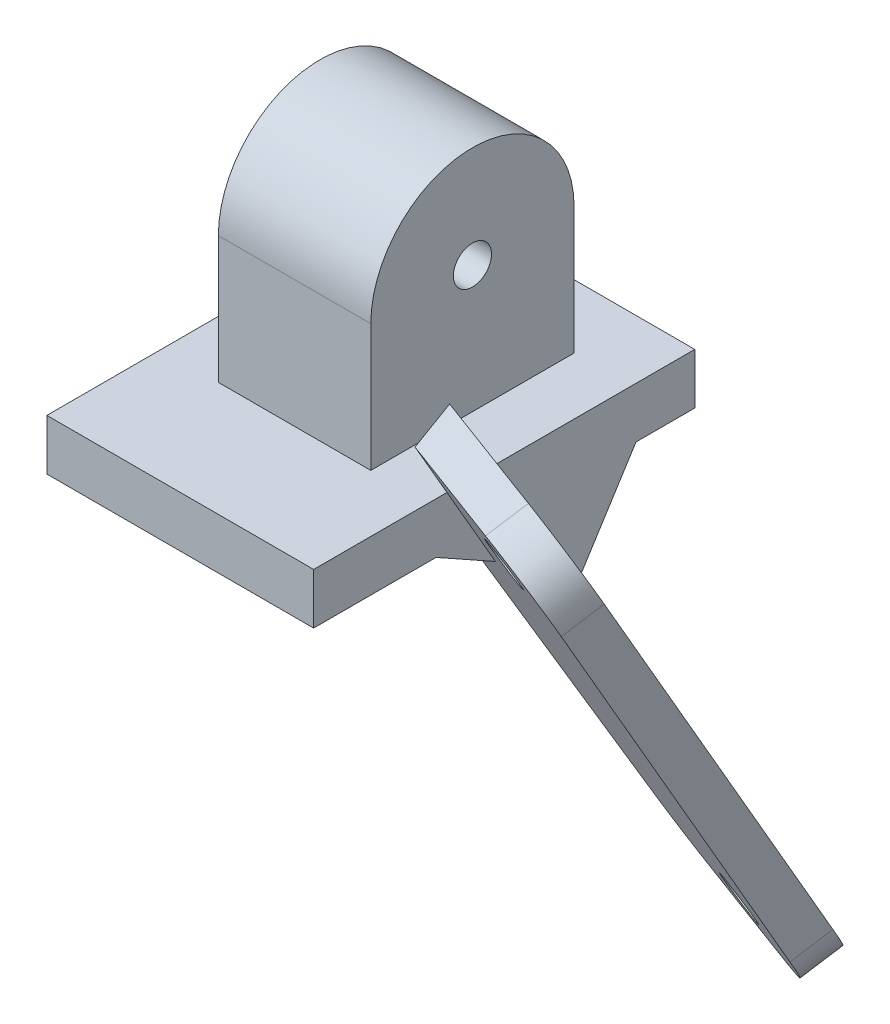
ISO-10303-21;
HEADER;
FILE_DESCRIPTION(('STEP AP214'),'2;1');
FILE_NAME('part.step','',(''),(''),'','','');
FILE_SCHEMA(('AUTOMOTIVE_DESIGN { 1 0 10303 214 1 1 1 1 }'));
ENDSEC;
DATA;
#1=APPLICATION_CONTEXT('core data for automotive mechanical design processes');
#2=APPLICATION_PROTOCOL_DEFINITION('international standard','automotive_design',2000,#1);
#3=PRODUCT_CONTEXT('',#1,'mechanical');
#4=PRODUCT('Part','Part','',(#3));
#5=PRODUCT_RELATED_PRODUCT_CATEGORY('part','',(#4));
#6=PRODUCT_DEFINITION_FORMATION('','',#4);
#7=PRODUCT_DEFINITION_CONTEXT('part definition',#1,'design');
#8=PRODUCT_DEFINITION('design','',#6,#7);
#9=PRODUCT_DEFINITION_SHAPE('','',#8);
#10=(LENGTH_UNIT() NAMED_UNIT(*) SI_UNIT(.MILLI.,.METRE.));
#11=(NAMED_UNIT(*) PLANE_ANGLE_UNIT() SI_UNIT($,.RADIAN.));
#12=(NAMED_UNIT(*) SI_UNIT($,.STERADIAN.) SOLID_ANGLE_UNIT());
#13=UNCERTAINTY_MEASURE_WITH_UNIT(LENGTH_MEASURE(1.E-05),#10,'distance_accuracy_value','');
#14=(GEOMETRIC_REPRESENTATION_CONTEXT(3) GLOBAL_UNCERTAINTY_ASSIGNED_CONTEXT((#13)) GLOBAL_UNIT_ASSIGNED_CONTEXT((#10,
#11,#12)) REPRESENTATION_CONTEXT('',''));
#15=CARTESIAN_POINT('',(0.,0.,0.));
#16=DIRECTION('',(0.,0.,1.));
#17=DIRECTION('',(1.,0.,0.));
#18=AXIS2_PLACEMENT_3D('',#15,#16,#17);
#19=CARTESIAN_POINT('',(16.5,24.,5.));
#20=DIRECTION('',(-1.,0.,0.));
#21=DIRECTION('',(0.,0.,1.));
#22=AXIS2_PLACEMENT_3D('',#19,#20,#21);
#23=PLANE('',#22);
#24=CARTESIAN_POINT('',(16.5,14.,13.));
#25=DIRECTION('',(1.,0.,0.));
#26=DIRECTION('',(0.,0.,-1.));
#27=AXIS2_PLACEMENT_3D('',#24,#25,#26);
#28=CIRCLE('',#27,1.5);
#29=CARTESIAN_POINT('',(16.5,14.,11.5));
#30=VERTEX_POINT('',#29);
#31=EDGE_CURVE('E403',#30,#30,#28,.T.);
#32=ORIENTED_EDGE('',*,*,#31,.F.);
#33=EDGE_LOOP('',(#32));
#34=FACE_BOUND('',#33,.T.);
#35=CARTESIAN_POINT('',(16.5,14.,13.));
#36=DIRECTION('',(-1.,0.,0.));
#37=DIRECTION('',(0.,0.,1.));
#38=AXIS2_PLACEMENT_3D('',#35,#36,#37);
#39=CIRCLE('',#38,8.);
#40=CARTESIAN_POINT('',(16.5,14.,21.));
#41=VERTEX_POINT('',#40);
#42=CARTESIAN_POINT('',(16.5,14.,5.));
#43=VERTEX_POINT('',#42);
#44=EDGE_CURVE('E75',#41,#43,#39,.T.);
#45=ORIENTED_EDGE('',*,*,#44,.F.);
#46=DIRECTION('',(0.,-1.,0.));
#47=VECTOR('',#46,1.);
#48=CARTESIAN_POINT('',(16.5,24.,21.));
#49=LINE('',#48,#47);
#50=CARTESIAN_POINT('',(16.5,4.,21.));
#51=VERTEX_POINT('',#50);
#52=EDGE_CURVE('E234',#41,#51,#49,.T.);
#53=ORIENTED_EDGE('',*,*,#52,.T.);
#54=DIRECTION('',(0.,0.,-1.));
#55=VECTOR('',#54,1.);
#56=CARTESIAN_POINT('',(16.5,4.,5.));
#57=LINE('',#56,#55);
#58=CARTESIAN_POINT('',(16.5,4.,5.));
#59=VERTEX_POINT('',#58);
#60=EDGE_CURVE('E412',#51,#59,#57,.T.);
#61=ORIENTED_EDGE('',*,*,#60,.T.);
#62=DIRECTION('',(0.,-1.,0.));
#63=VECTOR('',#62,1.);
#64=CARTESIAN_POINT('',(16.5,24.,5.));
#65=LINE('',#64,#63);
#66=EDGE_CURVE('E245',#43,#59,#65,.T.);
#67=ORIENTED_EDGE('',*,*,#66,.F.);
#68=EDGE_LOOP('',(#45,#53,#61,#67));
#69=FACE_BOUND('',#68,.T.);
#70=ADVANCED_FACE('F59',(#34,#69),#23,.F.);
#71=CARTESIAN_POINT('',(4.5,24.,5.));
#72=DIRECTION('',(1.,0.,0.));
#73=DIRECTION('',(0.,0.,-1.));
#74=AXIS2_PLACEMENT_3D('',#71,#72,#73);
#75=PLANE('',#74);
#76=CARTESIAN_POINT('',(4.49999999999999,14.,13.));
#77=DIRECTION('',(1.,0.,0.));
#78=DIRECTION('',(0.,0.,-1.));
#79=AXIS2_PLACEMENT_3D('',#76,#77,#78);
#80=CIRCLE('',#79,1.5);
#81=CARTESIAN_POINT('',(4.49999999999999,14.,11.5));
#82=VERTEX_POINT('',#81);
#83=EDGE_CURVE('E404',#82,#82,#80,.T.);
#84=ORIENTED_EDGE('',*,*,#83,.T.);
#85=EDGE_LOOP('',(#84));
#86=FACE_BOUND('',#85,.T.);
#87=CARTESIAN_POINT('',(4.5,14.,13.));
#88=DIRECTION('',(-1.,0.,0.));
#89=DIRECTION('',(0.,0.,1.));
#90=AXIS2_PLACEMENT_3D('',#87,#88,#89);
#91=CIRCLE('',#90,8.);
#92=CARTESIAN_POINT('',(4.5,14.,21.));
#93=VERTEX_POINT('',#92);
#94=CARTESIAN_POINT('',(4.5,14.,5.));
#95=VERTEX_POINT('',#94);
#96=EDGE_CURVE('E219',#93,#95,#91,.T.);
#97=ORIENTED_EDGE('',*,*,#96,.T.);
#98=DIRECTION('',(0.,-1.,0.));
#99=VECTOR('',#98,1.);
#100=CARTESIAN_POINT('',(4.5,24.,5.));
#101=LINE('',#100,#99);
#102=CARTESIAN_POINT('',(4.5,4.,5.));
#103=VERTEX_POINT('',#102);
#104=EDGE_CURVE('E418',#95,#103,#101,.T.);
#105=ORIENTED_EDGE('',*,*,#104,.T.);
#106=DIRECTION('',(0.,0.,1.));
#107=VECTOR('',#106,1.);
#108=CARTESIAN_POINT('',(4.5,4.,5.));
#109=LINE('',#108,#107);
#110=CARTESIAN_POINT('',(4.5,4.,21.));
#111=VERTEX_POINT('',#110);
#112=EDGE_CURVE('E239',#103,#111,#109,.T.);
#113=ORIENTED_EDGE('',*,*,#112,.T.);
#114=DIRECTION('',(0.,-1.,0.));
#115=VECTOR('',#114,1.);
#116=CARTESIAN_POINT('',(4.5,24.,21.));
#117=LINE('',#116,#115);
#118=EDGE_CURVE('E232',#93,#111,#117,.T.);
#119=ORIENTED_EDGE('',*,*,#118,.F.);
#120=EDGE_LOOP('',(#97,#105,#113,#119));
#121=FACE_BOUND('',#120,.T.);
#122=ADVANCED_FACE('F237',(#86,#121),#75,.F.);
#123=CARTESIAN_POINT('',(4.5,24.,5.));
#124=DIRECTION('',(0.,0.,1.));
#125=DIRECTION('',(1.,0.,0.));
#126=AXIS2_PLACEMENT_3D('',#123,#124,#125);
#127=PLANE('',#126);
#128=DIRECTION('',(-1.,0.,0.));
#129=VECTOR('',#128,1.);
#130=CARTESIAN_POINT('',(44.5,14.,5.));
#131=LINE('',#130,#129);
#132=EDGE_CURVE('E223',#43,#95,#131,.T.);
#133=ORIENTED_EDGE('',*,*,#132,.F.);
#134=ORIENTED_EDGE('',*,*,#66,.T.);
#135=DIRECTION('',(-1.,0.,0.));
#136=VECTOR('',#135,1.);
#137=CARTESIAN_POINT('',(4.5,4.,5.));
#138=LINE('',#137,#136);
#139=EDGE_CURVE('E415',#59,#103,#138,.T.);
#140=ORIENTED_EDGE('',*,*,#139,.T.);
#141=ORIENTED_EDGE('',*,*,#104,.F.);
#142=EDGE_LOOP('',(#133,#134,#140,#141));
#143=FACE_BOUND('',#142,.T.);
#144=ADVANCED_FACE('F421',(#143),#127,.F.);
#145=CARTESIAN_POINT('',(0.,0.,0.));
#146=DIRECTION('',(0.,1.,0.));
#147=DIRECTION('',(0.,0.,1.));
#148=AXIS2_PLACEMENT_3D('',#145,#146,#147);
#149=PLANE('',#148);
#150=DIRECTION('',(0.,0.,-1.));
#151=VECTOR('',#150,1.);
#152=CARTESIAN_POINT('',(21.,0.,0.));
#153=LINE('',#152,#151);
#154=CARTESIAN_POINT('',(21.,0.,4.62668487913654));
#155=VERTEX_POINT('',#154);
#156=CARTESIAN_POINT('',(21.,0.,0.));
#157=VERTEX_POINT('',#156);
#158=EDGE_CURVE('E262',#155,#157,#153,.T.);
#159=ORIENTED_EDGE('',*,*,#158,.F.);
#160=DIRECTION('',(-0.939692620785907,0.,-0.342020143325673));
#161=VECTOR('',#160,1.);
#162=CARTESIAN_POINT('',(10.2155863177674,0.,0.701479304790656));
#163=LINE('',#162,#161);
#164=CARTESIAN_POINT('',(8.28828776764036,0.,0.));
#165=VERTEX_POINT('',#164);
#166=EDGE_CURVE('E326',#155,#165,#163,.T.);
#167=ORIENTED_EDGE('',*,*,#166,.T.);
#168=DIRECTION('',(-1.,0.,0.));
#169=VECTOR('',#168,1.);
#170=CARTESIAN_POINT('',(0.,0.,0.));
#171=LINE('',#170,#169);
#172=EDGE_CURVE('E253',#157,#165,#171,.T.);
#173=ORIENTED_EDGE('',*,*,#172,.F.);
#174=EDGE_LOOP('',(#159,#167,#173));
#175=FACE_BOUND('',#174,.T.);
#176=ADVANCED_FACE('F509',(#175),#149,.F.);
#177=CARTESIAN_POINT('',(21.9018797354497,9.78209952844714,19.5429186044547));
#178=DIRECTION('',(0.,-0.866025403784436,-0.500000000000004));
#179=DIRECTION('',(0.,0.500000000000004,-0.866025403784436));
#180=AXIS2_PLACEMENT_3D('',#177,#178,#179);
#181=PLANE('',#180);
#182=DIRECTION('',(0.953741925422946,-0.150313289241614,0.260350254019269));
#183=VECTOR('',#182,1.);
#184=CARTESIAN_POINT('',(21.,8.3514866403127,22.0208128126663));
#185=LINE('',#184,#183);
#186=CARTESIAN_POINT('',(21.,8.35148664031271,22.0208128126663));
#187=VERTEX_POINT('',#186);
#188=CARTESIAN_POINT('',(28.6299354033836,7.14898032637979,24.1036148448205));
#189=VERTEX_POINT('',#188);
#190=EDGE_CURVE('E376',#187,#189,#185,.T.);
#191=ORIENTED_EDGE('',*,*,#190,.T.);
#192=DIRECTION('',(-0.300626578483225,-0.476870962711477,0.825964736070553));
#193=VECTOR('',#192,1.);
#194=CARTESIAN_POINT('',(29.5318151388332,8.57959321451423,21.6257206366088));
#195=LINE('',#194,#193);
#196=CARTESIAN_POINT('',(29.5318151388332,8.57959321451423,21.6257206366088));
#197=VERTEX_POINT('',#196);
#198=EDGE_CURVE('E317',#189,#197,#195,.F.);
#199=ORIENTED_EDGE('',*,*,#198,.T.);
#200=DIRECTION('',(0.953741925422946,-0.150313289241614,0.260350254019268));
#201=VECTOR('',#200,1.);
#202=CARTESIAN_POINT('',(21.9018797354497,9.78209952844714,19.5429186044547));
#203=LINE('',#202,#201);
#204=CARTESIAN_POINT('',(21.,9.92423914286713,19.296725570511));
#205=VERTEX_POINT('',#204);
#206=EDGE_CURVE('E377',#205,#197,#203,.T.);
#207=ORIENTED_EDGE('',*,*,#206,.F.);
#208=DIRECTION('',(0.,0.500000000000004,-0.866025403784436));
#209=VECTOR('',#208,1.);
#210=CARTESIAN_POINT('',(21.,9.78209952844714,19.5429186044547));
#211=LINE('',#210,#209);
#212=EDGE_CURVE('E372',#187,#205,#211,.T.);
#213=ORIENTED_EDGE('',*,*,#212,.F.);
#214=EDGE_LOOP('',(#191,#199,#207,#213));
#215=FACE_BOUND('',#214,.T.);
#216=ADVANCED_FACE('F467',(#215),#181,.F.);
#217=CARTESIAN_POINT('',(-1.47086821116475,-2.33317474262837,4.04117719716872));
#218=DIRECTION('',(-0.300626578483225,-0.476870962711477,0.825964736070553));
#219=DIRECTION('',(0.,-0.866025403784436,-0.500000000000004));
#220=AXIS2_PLACEMENT_3D('',#217,#218,#219);
#221=PLANE('',#220);
#222=CARTESIAN_POINT('',(28.1012022506988,4.47493612945445,18.7351952555799));
#223=DIRECTION('',(-0.300626578483225,-0.476870962711477,0.825964736070553));
#224=DIRECTION('',(0.,-0.866025403784436,-0.500000000000004));
#225=AXIS2_PLACEMENT_3D('',#222,#223,#224);
#226=CIRCLE('',#225,1.8);
#227=CARTESIAN_POINT('',(28.1012022506988,2.91609040264247,17.8351952555799));
#228=VERTEX_POINT('',#227);
#229=EDGE_CURVE('E358',#228,#228,#226,.T.);
#230=ORIENTED_EDGE('',*,*,#229,.T.);
#231=EDGE_LOOP('',(#230));
#232=FACE_BOUND('',#231,.T.);
#233=CARTESIAN_POINT('',(28.1012022506988,-27.5680038105697,0.23519525557973));
#234=DIRECTION('',(-0.300626578483225,-0.476870962711477,0.825964736070553));
#235=DIRECTION('',(0.,-0.866025403784436,-0.500000000000004));
#236=AXIS2_PLACEMENT_3D('',#233,#234,#235);
#237=CIRCLE('',#236,1.8);
#238=CARTESIAN_POINT('',(28.1012022506988,-29.1268495373817,-0.664804744420276));
#239=VERTEX_POINT('',#238);
#240=EDGE_CURVE('E362',#239,#239,#237,.T.);
#241=ORIENTED_EDGE('',*,*,#240,.T.);
#242=EDGE_LOOP('',(#241));
#243=FACE_BOUND('',#242,.T.);
#244=CARTESIAN_POINT('',(12.1109458051018,-6.70516727500116,6.46038216096882));
#245=DIRECTION('',(-0.300626578483225,-0.476870962711477,0.825964736070553));
#246=DIRECTION('',(0.,-0.866025403784436,-0.500000000000004));
#247=AXIS2_PLACEMENT_3D('',#244,#245,#246);
#248=CIRCLE('',#247,5.);
#249=CARTESIAN_POINT('',(7.84568224862731,-7.96943748277319,4.17802644032608));
#250=VERTEX_POINT('',#249);
#251=CARTESIAN_POINT('',(7.59495621370453,-7.38435481355739,4.42456726322852));
#252=VERTEX_POINT('',#251);
#253=EDGE_CURVE('E304',#250,#252,#248,.F.);
#254=ORIENTED_EDGE('',*,*,#253,.T.);
#255=DIRECTION('',(0.939692620785907,0.,0.342020143325673));
#256=VECTOR('',#255,1.);
#257=CARTESIAN_POINT('',(22.3702172473642,-7.38435481355739,9.80232248299399));
#258=LINE('',#257,#256);
#259=CARTESIAN_POINT('',(21.,-7.38435481355739,9.30360419047524));
#260=VERTEX_POINT('',#259);
#261=EDGE_CURVE('E319',#252,#260,#258,.T.);
#262=ORIENTED_EDGE('',*,*,#261,.T.);
#263=DIRECTION('',(0.,0.866025403784436,0.500000000000004));
#264=VECTOR('',#263,1.);
#265=CARTESIAN_POINT('',(21.,-2.87466749124288,11.9072733799746));
#266=LINE('',#265,#264);
#267=CARTESIAN_POINT('',(21.,4.,15.8763645066329));
#268=VERTEX_POINT('',#267);
#269=EDGE_CURVE('E400',#260,#268,#266,.T.);
#270=ORIENTED_EDGE('',*,*,#269,.T.);
#271=DIRECTION('',(0.,-0.866025403784436,-0.500000000000004));
#272=VECTOR('',#271,1.);
#273=CARTESIAN_POINT('',(21.,-5.87466749124286,10.1752225724057));
#274=LINE('',#273,#272);
#275=EDGE_CURVE('E374',#205,#268,#274,.T.);
#276=ORIENTED_EDGE('',*,*,#275,.F.);
#277=ORIENTED_EDGE('',*,*,#206,.T.);
#278=CARTESIAN_POINT('',(29.5318151388332,4.24946619559205,19.1257206366088));
#279=DIRECTION('',(-0.300626578483225,-0.476870962711477,0.825964736070553));
#280=DIRECTION('',(0.,-0.866025403784436,-0.500000000000004));
#281=AXIS2_PLACEMENT_3D('',#278,#279,#280);
#282=CIRCLE('',#281,5.);
#283=CARTESIAN_POINT('',(34.300524765948,3.49789974938397,20.4274719067051));
#284=VERTEX_POINT('',#283);
#285=EDGE_CURVE('E298',#197,#284,#282,.F.);
#286=ORIENTED_EDGE('',*,*,#285,.T.);
#287=DIRECTION('',(0.,-0.866025403784436,-0.500000000000004));
#288=VECTOR('',#287,1.);
#289=CARTESIAN_POINT('',(34.300524765948,7.82802676830616,22.9274719067051));
#290=LINE('',#289,#288);
#291=CARTESIAN_POINT('',(34.300524765948,-27.6790147868557,2.42747190670498));
#292=VERTEX_POINT('',#291);
#293=EDGE_CURVE('E380',#284,#292,#290,.T.);
#294=ORIENTED_EDGE('',*,*,#293,.T.);
#295=CARTESIAN_POINT('',(29.5318151388332,-26.9274483406477,1.12572063660863));
#296=DIRECTION('',(-0.300626578483225,-0.476870962711477,0.825964736070553));
#297=DIRECTION('',(0.,-0.866025403784436,-0.500000000000004));
#298=AXIS2_PLACEMENT_3D('',#295,#296,#297);
#299=CIRCLE('',#298,5.);
#300=CARTESIAN_POINT('',(29.5318151388332,-31.2575753595698,-1.37427936339139));
#301=VERTEX_POINT('',#300);
#302=EDGE_CURVE('E300',#292,#301,#299,.F.);
#303=ORIENTED_EDGE('',*,*,#302,.T.);
#304=DIRECTION('',(-0.953741925422946,0.150313289241614,-0.260350254019268));
#305=VECTOR('',#304,1.);
#306=CARTESIAN_POINT('',(34.300524765948,-32.0091418057779,-0.0725280932950489));
#307=LINE('',#306,#305);
#308=CARTESIAN_POINT('',(21.7343639150982,-30.0286679267537,-3.50280947482801));
#309=VERTEX_POINT('',#308);
#310=EDGE_CURVE('E384',#301,#309,#307,.T.);
#311=ORIENTED_EDGE('',*,*,#310,.T.);
#312=CARTESIAN_POINT('',(21.7343639150982,-25.6985409078315,-1.00280947482799));
#313=DIRECTION('',(-0.300626578483225,-0.476870962711477,0.825964736070553));
#314=DIRECTION('',(0.,-0.866025403784436,-0.500000000000004));
#315=AXIS2_PLACEMENT_3D('',#312,#313,#314);
#316=CIRCLE('',#315,5.);
#317=CARTESIAN_POINT('',(17.4691003586237,-26.9628111156035,-3.28516519547073));
#318=VERTEX_POINT('',#317);
#319=EDGE_CURVE('E302',#309,#318,#316,.F.);
#320=ORIENTED_EDGE('',*,*,#319,.T.);
#321=DIRECTION('',(-0.426526355647448,0.841818815774649,0.330781422310677));
#322=VECTOR('',#321,1.);
#323=CARTESIAN_POINT('',(4.14633422216601,-0.668175242959791,7.04695959208309));
#324=LINE('',#323,#322);
#325=EDGE_CURVE('E347',#318,#250,#324,.T.);
#326=ORIENTED_EDGE('',*,*,#325,.T.);
#327=EDGE_LOOP('',(#254,#262,#270,#276,#277,#286,#294,#303,#311,#320,#326));
#328=FACE_BOUND('',#327,.T.);
#329=ADVANCED_FACE('F470',(#232,#243,#328),#221,.F.);
#330=CARTESIAN_POINT('',(-2.37274794661443,-3.7637876307628,6.51907140538038));
#331=DIRECTION('',(-0.300626578483225,-0.476870962711477,0.825964736070553));
#332=DIRECTION('',(0.,-0.866025403784436,-0.500000000000004));
#333=AXIS2_PLACEMENT_3D('',#330,#331,#332);
#334=PLANE('',#333);
#335=DIRECTION('',(0.,0.866025403784436,0.500000000000004));
#336=VECTOR('',#335,1.);
#337=CARTESIAN_POINT('',(21.,-4.4474199937973,14.6313606221299));
#338=LINE('',#337,#336);
#339=CARTESIAN_POINT('',(21.,-2.61564518644261,15.6889363002509));
#340=VERTEX_POINT('',#339);
#341=CARTESIAN_POINT('',(21.,4.,19.5084808295067));
#342=VERTEX_POINT('',#341);
#343=EDGE_CURVE('E387',#340,#342,#338,.T.);
#344=ORIENTED_EDGE('',*,*,#343,.F.);
#345=DIRECTION('',(-0.939692620785907,0.,-0.342020143325673));
#346=VECTOR('',#345,1.);
#347=CARTESIAN_POINT('',(-2.5857935842306,-2.61564518644261,7.10440948404413));
#348=LINE('',#347,#346);
#349=CARTESIAN_POINT('',(3.44949686227394,-2.61564518644261,9.30107556172299));
#350=VERTEX_POINT('',#349);
#351=EDGE_CURVE('E331',#340,#350,#348,.T.);
#352=ORIENTED_EDGE('',*,*,#351,.T.);
#353=DIRECTION('',(-0.680788787401634,0.713808179397935,0.164330490088779));
#354=VECTOR('',#353,1.);
#355=CARTESIAN_POINT('',(4.94432523041336,-4.18297522436301,8.94025017376013));
#356=LINE('',#355,#354);
#357=CARTESIAN_POINT('',(6.4403564425374,-5.75156644620807,8.57913444032573));
#358=VERTEX_POINT('',#357);
#359=EDGE_CURVE('E341',#350,#358,#356,.F.);
#360=ORIENTED_EDGE('',*,*,#359,.T.);
#361=DIRECTION('',(0.,0.866025403784436,0.500000000000004));
#362=VECTOR('',#361,1.);
#363=CARTESIAN_POINT('',(6.4403564425374,10.6461408386559,18.0463551553347));
#364=LINE('',#363,#362);
#365=CARTESIAN_POINT('',(6.4403564425374,-7.38421371692752,7.63652509908414));
#366=VERTEX_POINT('',#365);
#367=EDGE_CURVE('E381',#366,#358,#364,.T.);
#368=ORIENTED_EDGE('',*,*,#367,.F.);
#369=CARTESIAN_POINT('',(11.2090660696521,-8.13578016313559,8.93827636918048));
#370=DIRECTION('',(-0.300626578483225,-0.476870962711477,0.825964736070553));
#371=DIRECTION('',(0.,-0.866025403784436,-0.500000000000004));
#372=AXIS2_PLACEMENT_3D('',#369,#370,#371);
#373=CIRCLE('',#372,5.);
#374=CARTESIAN_POINT('',(6.94380251317764,-9.40005037090762,6.65592064853774));
#375=VERTEX_POINT('',#374);
#376=EDGE_CURVE('E291',#366,#375,#373,.T.);
#377=ORIENTED_EDGE('',*,*,#376,.T.);
#378=DIRECTION('',(-0.426526355647448,0.841818815774649,0.330781422310677));
#379=VECTOR('',#378,1.);
#380=CARTESIAN_POINT('',(3.24445448671633,-2.09878813109422,9.52485380029475));
#381=LINE('',#380,#379);
#382=CARTESIAN_POINT('',(16.567220623174,-28.393424003738,-0.807270987259074));
#383=VERTEX_POINT('',#382);
#384=EDGE_CURVE('E352',#383,#375,#381,.T.);
#385=ORIENTED_EDGE('',*,*,#384,.F.);
#386=CARTESIAN_POINT('',(20.8324841796485,-27.1291537959659,1.47508473338367));
#387=DIRECTION('',(-0.300626578483225,-0.476870962711477,0.825964736070553));
#388=DIRECTION('',(0.,-0.866025403784436,-0.500000000000004));
#389=AXIS2_PLACEMENT_3D('',#386,#387,#388);
#390=CIRCLE('',#389,5.);
#391=CARTESIAN_POINT('',(20.8324841796485,-31.4592808148881,-1.02491526661635));
#392=VERTEX_POINT('',#391);
#393=EDGE_CURVE('E289',#383,#392,#390,.T.);
#394=ORIENTED_EDGE('',*,*,#393,.T.);
#395=DIRECTION('',(-0.953741925422946,0.150313289241614,-0.260350254019269));
#396=VECTOR('',#395,1.);
#397=CARTESIAN_POINT('',(6.44035644253739,-29.1910277354282,-4.95364484466546));
#398=LINE('',#397,#396);
#399=CARTESIAN_POINT('',(28.6299354033836,-32.6881882477043,1.10361484482027));
#400=VERTEX_POINT('',#399);
#401=EDGE_CURVE('E393',#400,#392,#398,.T.);
#402=ORIENTED_EDGE('',*,*,#401,.F.);
#403=CARTESIAN_POINT('',(28.6299354033836,-28.3580612287821,3.60361484482029));
#404=DIRECTION('',(-0.300626578483225,-0.476870962711477,0.825964736070553));
#405=DIRECTION('',(0.,-0.866025403784436,-0.500000000000004));
#406=AXIS2_PLACEMENT_3D('',#403,#404,#405);
#407=CIRCLE('',#406,5.);
#408=CARTESIAN_POINT('',(33.3986450304983,-29.1096276749902,4.90536611491663));
#409=VERTEX_POINT('',#408);
#410=EDGE_CURVE('E287',#400,#409,#407,.T.);
#411=ORIENTED_EDGE('',*,*,#410,.T.);
#412=DIRECTION('',(0.,-0.866025403784436,-0.500000000000004));
#413=VECTOR('',#412,1.);
#414=CARTESIAN_POINT('',(33.3986450304983,6.39741388017172,25.4053661149168));
#415=LINE('',#414,#413);
#416=CARTESIAN_POINT('',(33.3986450304983,2.06728686124954,22.9053661149168));
#417=VERTEX_POINT('',#416);
#418=EDGE_CURVE('E390',#417,#409,#415,.T.);
#419=ORIENTED_EDGE('',*,*,#418,.F.);
#420=CARTESIAN_POINT('',(28.6299354033836,2.81885330745762,21.6036148448204));
#421=DIRECTION('',(-0.300626578483225,-0.476870962711477,0.825964736070553));
#422=DIRECTION('',(0.,-0.866025403784436,-0.500000000000004));
#423=AXIS2_PLACEMENT_3D('',#420,#421,#422);
#424=CIRCLE('',#423,5.);
#425=EDGE_CURVE('E285',#417,#189,#424,.T.);
#426=ORIENTED_EDGE('',*,*,#425,.T.);
#427=ORIENTED_EDGE('',*,*,#190,.F.);
#428=DIRECTION('',(0.,-0.866025403784436,-0.500000000000004));
#429=VECTOR('',#428,1.);
#430=CARTESIAN_POINT('',(21.,-7.44741999379728,12.899309814561));
#431=LINE('',#430,#429);
#432=EDGE_CURVE('E280',#187,#342,#431,.T.);
#433=ORIENTED_EDGE('',*,*,#432,.T.);
#434=EDGE_LOOP('',(#344,#352,#360,#368,#377,#385,#394,#402,#411,#419,#426,#427,#433));
#435=FACE_BOUND('',#434,.T.);
#436=CARTESIAN_POINT('',(27.1993225152492,3.04432324132002,21.2130894637915));
#437=DIRECTION('',(-0.300626578483225,-0.476870962711477,0.825964736070553));
#438=DIRECTION('',(0.,-0.866025403784436,-0.500000000000004));
#439=AXIS2_PLACEMENT_3D('',#436,#437,#438);
#440=CIRCLE('',#439,1.8);
#441=CARTESIAN_POINT('',(27.1993225152492,1.48547751450804,20.3130894637915));
#442=VERTEX_POINT('',#441);
#443=EDGE_CURVE('E369',#442,#442,#440,.T.);
#444=ORIENTED_EDGE('',*,*,#443,.F.);
#445=EDGE_LOOP('',(#444));
#446=FACE_BOUND('',#445,.T.);
#447=CARTESIAN_POINT('',(27.1993225152492,-28.9986166987041,2.71308946379139));
#448=DIRECTION('',(-0.300626578483225,-0.476870962711477,0.825964736070553));
#449=DIRECTION('',(0.,-0.866025403784436,-0.500000000000004));
#450=AXIS2_PLACEMENT_3D('',#447,#448,#449);
#451=CIRCLE('',#450,1.8);
#452=CARTESIAN_POINT('',(27.1993225152492,-30.5574624255161,1.81308946379138));
#453=VERTEX_POINT('',#452);
#454=EDGE_CURVE('E366',#453,#453,#451,.T.);
#455=ORIENTED_EDGE('',*,*,#454,.F.);
#456=EDGE_LOOP('',(#455));
#457=FACE_BOUND('',#456,.T.);
#458=ADVANCED_FACE('F458',(#435,#446,#457),#334,.T.);
#459=CARTESIAN_POINT('',(21.,4.,0.));
#460=DIRECTION('',(-1.,0.,0.));
#461=DIRECTION('',(0.,0.,1.));
#462=AXIS2_PLACEMENT_3D('',#459,#460,#461);
#463=PLANE('',#462);
#464=ORIENTED_EDGE('',*,*,#269,.F.);
#465=DIRECTION('',(0.,-0.84481073593832,0.535065248771918));
#466=VECTOR('',#465,1.);
#467=CARTESIAN_POINT('',(21.,4.94621584021188,1.49397349605607));
#468=LINE('',#467,#466);
#469=EDGE_CURVE('E333',#260,#155,#468,.F.);
#470=ORIENTED_EDGE('',*,*,#469,.T.);
#471=ORIENTED_EDGE('',*,*,#158,.T.);
#472=DIRECTION('',(0.,-1.,0.));
#473=VECTOR('',#472,1.);
#474=CARTESIAN_POINT('',(21.,4.,0.));
#475=LINE('',#474,#473);
#476=CARTESIAN_POINT('',(21.,4.,0.));
#477=VERTEX_POINT('',#476);
#478=EDGE_CURVE('E271',#477,#157,#475,.T.);
#479=ORIENTED_EDGE('',*,*,#478,.F.);
#480=DIRECTION('',(0.,0.,-1.));
#481=VECTOR('',#480,1.);
#482=CARTESIAN_POINT('',(21.,4.,0.));
#483=LINE('',#482,#481);
#484=EDGE_CURVE('E255',#268,#477,#483,.T.);
#485=ORIENTED_EDGE('',*,*,#484,.F.);
#486=EDGE_LOOP('',(#464,#470,#471,#479,#485));
#487=FACE_BOUND('',#486,.T.);
#488=ADVANCED_FACE('F430',(#487),#463,.F.);
#489=CARTESIAN_POINT('',(0.,4.,0.));
#490=DIRECTION('',(0.,1.,0.));
#491=DIRECTION('',(0.,0.,1.));
#492=AXIS2_PLACEMENT_3D('',#489,#490,#491);
#493=PLANE('',#492);
#494=ORIENTED_EDGE('',*,*,#60,.F.);
#495=DIRECTION('',(1.,0.,0.));
#496=VECTOR('',#495,1.);
#497=CARTESIAN_POINT('',(4.5,4.,21.));
#498=LINE('',#497,#496);
#499=EDGE_CURVE('E410',#111,#51,#498,.T.);
#500=ORIENTED_EDGE('',*,*,#499,.F.);
#501=ORIENTED_EDGE('',*,*,#112,.F.);
#502=ORIENTED_EDGE('',*,*,#139,.F.);
#503=EDGE_LOOP('',(#494,#500,#501,#502));
#504=FACE_BOUND('',#503,.T.);
#505=ORIENTED_EDGE('',*,*,#484,.T.);
#506=DIRECTION('',(-1.,0.,0.));
#507=VECTOR('',#506,1.);
#508=CARTESIAN_POINT('',(0.,4.,0.));
#509=LINE('',#508,#507);
#510=CARTESIAN_POINT('',(0.,4.,0.));
#511=VERTEX_POINT('',#510);
#512=EDGE_CURVE('E258',#477,#511,#509,.T.);
#513=ORIENTED_EDGE('',*,*,#512,.T.);
#514=DIRECTION('',(0.,0.,1.));
#515=VECTOR('',#514,1.);
#516=CARTESIAN_POINT('',(0.,4.,0.));
#517=LINE('',#516,#515);
#518=CARTESIAN_POINT('',(0.,4.,30.));
#519=VERTEX_POINT('',#518);
#520=EDGE_CURVE('E249',#511,#519,#517,.T.);
#521=ORIENTED_EDGE('',*,*,#520,.T.);
#522=DIRECTION('',(1.,0.,0.));
#523=VECTOR('',#522,1.);
#524=CARTESIAN_POINT('',(0.,4.,30.));
#525=LINE('',#524,#523);
#526=CARTESIAN_POINT('',(21.,4.,30.));
#527=VERTEX_POINT('',#526);
#528=EDGE_CURVE('E252',#519,#527,#525,.T.);
#529=ORIENTED_EDGE('',*,*,#528,.T.);
#530=EDGE_CURVE('E256',#527,#342,#483,.T.);
#531=ORIENTED_EDGE('',*,*,#530,.T.);
#532=DIRECTION('',(0.,0.,-1.));
#533=VECTOR('',#532,1.);
#534=CARTESIAN_POINT('',(21.,4.,23.5414123331734));
#535=LINE('',#534,#533);
#536=EDGE_CURVE('E365',#342,#268,#535,.T.);
#537=ORIENTED_EDGE('',*,*,#536,.T.);
#538=EDGE_LOOP('',(#505,#513,#521,#529,#531,#537));
#539=FACE_BOUND('',#538,.T.);
#540=ADVANCED_FACE('F426',(#504,#539),#493,.T.);
#541=CARTESIAN_POINT('',(3.65820995840766,0.,0.));
#542=VERTEX_POINT('',#541);
#543=CARTESIAN_POINT('',(0.,0.,0.));
#544=VERTEX_POINT('',#543);
#545=EDGE_CURVE('E266',#542,#544,#171,.T.);
#546=ORIENTED_EDGE('',*,*,#545,.F.);
#547=DIRECTION('',(-0.263342239326904,0.,0.964702474852372));
#548=VECTOR('',#547,1.);
#549=CARTESIAN_POINT('',(0.828041260088057,0.,10.3677661225071));
#550=LINE('',#549,#548);
#551=CARTESIAN_POINT('',(0.168513923006539,0.,12.7838147440331));
#552=VERTEX_POINT('',#551);
#553=EDGE_CURVE('E324',#542,#552,#550,.T.);
#554=ORIENTED_EDGE('',*,*,#553,.T.);
#555=DIRECTION('',(0.939692620785907,0.,0.342020143325673));
#556=VECTOR('',#555,1.);
#557=CARTESIAN_POINT('',(-4.08892647664673,0.,11.2342331643969));
#558=LINE('',#557,#556);
#559=CARTESIAN_POINT('',(21.,0.,20.3658556115896));
#560=VERTEX_POINT('',#559);
#561=EDGE_CURVE('E322',#552,#560,#558,.T.);
#562=ORIENTED_EDGE('',*,*,#561,.T.);
#563=CARTESIAN_POINT('',(21.,0.,30.));
#564=VERTEX_POINT('',#563);
#565=EDGE_CURVE('E263',#564,#560,#153,.T.);
#566=ORIENTED_EDGE('',*,*,#565,.F.);
#567=DIRECTION('',(1.,0.,0.));
#568=VECTOR('',#567,1.);
#569=CARTESIAN_POINT('',(0.,0.,30.));
#570=LINE('',#569,#568);
#571=CARTESIAN_POINT('',(0.,0.,30.));
#572=VERTEX_POINT('',#571);
#573=EDGE_CURVE('E243',#572,#564,#570,.T.);
#574=ORIENTED_EDGE('',*,*,#573,.F.);
#575=DIRECTION('',(0.,0.,1.));
#576=VECTOR('',#575,1.);
#577=CARTESIAN_POINT('',(0.,0.,0.));
#578=LINE('',#577,#576);
#579=EDGE_CURVE('E240',#544,#572,#578,.T.);
#580=ORIENTED_EDGE('',*,*,#579,.F.);
#581=EDGE_LOOP('',(#546,#554,#562,#566,#574,#580));
#582=FACE_BOUND('',#581,.T.);
#583=ADVANCED_FACE('F429',(#582),#149,.F.);
#584=CARTESIAN_POINT('',(0.,4.,0.));
#585=DIRECTION('',(1.,0.,0.));
#586=DIRECTION('',(0.,0.,-1.));
#587=AXIS2_PLACEMENT_3D('',#584,#585,#586);
#588=PLANE('',#587);
#589=ORIENTED_EDGE('',*,*,#579,.T.);
#590=DIRECTION('',(0.,-1.,0.));
#591=VECTOR('',#590,1.);
#592=CARTESIAN_POINT('',(0.,4.,30.));
#593=LINE('',#592,#591);
#594=EDGE_CURVE('E277',#519,#572,#593,.T.);
#595=ORIENTED_EDGE('',*,*,#594,.F.);
#596=ORIENTED_EDGE('',*,*,#520,.F.);
#597=DIRECTION('',(0.,-1.,0.));
#598=VECTOR('',#597,1.);
#599=CARTESIAN_POINT('',(0.,4.,0.));
#600=LINE('',#599,#598);
#601=EDGE_CURVE('E259',#511,#544,#600,.T.);
#602=ORIENTED_EDGE('',*,*,#601,.T.);
#603=EDGE_LOOP('',(#589,#595,#596,#602));
#604=FACE_BOUND('',#603,.T.);
#605=ADVANCED_FACE('F447',(#604),#588,.F.);
#606=CARTESIAN_POINT('',(0.,4.,30.));
#607=DIRECTION('',(0.,0.,-1.));
#608=DIRECTION('',(-1.,0.,0.));
#609=AXIS2_PLACEMENT_3D('',#606,#607,#608);
#610=PLANE('',#609);
#611=ORIENTED_EDGE('',*,*,#573,.T.);
#612=DIRECTION('',(0.,-1.,0.));
#613=VECTOR('',#612,1.);
#614=CARTESIAN_POINT('',(21.,4.,30.));
#615=LINE('',#614,#613);
#616=EDGE_CURVE('E274',#527,#564,#615,.T.);
#617=ORIENTED_EDGE('',*,*,#616,.F.);
#618=ORIENTED_EDGE('',*,*,#528,.F.);
#619=ORIENTED_EDGE('',*,*,#594,.T.);
#620=EDGE_LOOP('',(#611,#617,#618,#619));
#621=FACE_BOUND('',#620,.T.);
#622=ADVANCED_FACE('F451',(#621),#610,.F.);
#623=ORIENTED_EDGE('',*,*,#565,.T.);
#624=DIRECTION('',(0.,-0.488116069350406,-0.872778725016777));
#625=VECTOR('',#624,1.);
#626=CARTESIAN_POINT('',(21.,-7.72317805212531,6.55638299500066));
#627=LINE('',#626,#625);
#628=EDGE_CURVE('E68',#560,#340,#627,.T.);
#629=ORIENTED_EDGE('',*,*,#628,.T.);
#630=ORIENTED_EDGE('',*,*,#343,.T.);
#631=ORIENTED_EDGE('',*,*,#530,.F.);
#632=ORIENTED_EDGE('',*,*,#616,.T.);
#633=EDGE_LOOP('',(#623,#629,#630,#631,#632));
#634=FACE_BOUND('',#633,.T.);
#635=ADVANCED_FACE('F454',(#634),#463,.F.);
#636=CARTESIAN_POINT('',(0.,4.,0.));
#637=DIRECTION('',(0.,0.,1.));
#638=DIRECTION('',(1.,0.,0.));
#639=AXIS2_PLACEMENT_3D('',#636,#637,#638);
#640=PLANE('',#639);
#641=ORIENTED_EDGE('',*,*,#172,.T.);
#642=DIRECTION('',(0.867029906258276,0.498256100468188,0.));
#643=VECTOR('',#642,1.);
#644=CARTESIAN_POINT('',(3.78565496729999,-2.58752811724751,0.));
#645=LINE('',#644,#643);
#646=CARTESIAN_POINT('',(5.22601097520017,-1.75979868992082,0.));
#647=VERTEX_POINT('',#646);
#648=EDGE_CURVE('E335',#165,#647,#645,.F.);
#649=ORIENTED_EDGE('',*,*,#648,.T.);
#650=DIRECTION('',(0.665201397821064,-0.746663980875536,0.));
#651=VECTOR('',#650,1.);
#652=CARTESIAN_POINT('',(0.0527503312112518,4.04699516108451,0.));
#653=LINE('',#652,#651);
#654=EDGE_CURVE('E339',#647,#542,#653,.F.);
#655=ORIENTED_EDGE('',*,*,#654,.T.);
#656=ORIENTED_EDGE('',*,*,#545,.T.);
#657=ORIENTED_EDGE('',*,*,#601,.F.);
#658=ORIENTED_EDGE('',*,*,#512,.F.);
#659=ORIENTED_EDGE('',*,*,#478,.T.);
#660=EDGE_LOOP('',(#641,#649,#655,#656,#657,#658,#659));
#661=FACE_BOUND('',#660,.T.);
#662=ADVANCED_FACE('F441',(#661),#640,.F.);
#663=CARTESIAN_POINT('',(4.5,24.,21.));
#664=DIRECTION('',(0.,0.,-1.));
#665=DIRECTION('',(-1.,0.,0.));
#666=AXIS2_PLACEMENT_3D('',#663,#664,#665);
#667=PLANE('',#666);
#668=ORIENTED_EDGE('',*,*,#52,.F.);
#669=DIRECTION('',(-1.,0.,0.));
#670=VECTOR('',#669,1.);
#671=CARTESIAN_POINT('',(44.5,14.,21.));
#672=LINE('',#671,#670);
#673=EDGE_CURVE('E222',#41,#93,#672,.T.);
#674=ORIENTED_EDGE('',*,*,#673,.T.);
#675=ORIENTED_EDGE('',*,*,#118,.T.);
#676=ORIENTED_EDGE('',*,*,#499,.T.);
#677=EDGE_LOOP('',(#668,#674,#675,#676));
#678=FACE_BOUND('',#677,.T.);
#679=ADVANCED_FACE('F230',(#678),#667,.F.);
#680=CARTESIAN_POINT('',(4.49999999999999,14.,13.));
#681=DIRECTION('',(1.,0.,0.));
#682=DIRECTION('',(0.,0.,-1.));
#683=AXIS2_PLACEMENT_3D('',#680,#681,#682);
#684=CYLINDRICAL_SURFACE('',#683,1.5);
#685=ORIENTED_EDGE('',*,*,#83,.F.);
#686=EDGE_LOOP('',(#685));
#687=FACE_BOUND('',#686,.T.);
#688=ORIENTED_EDGE('',*,*,#31,.T.);
#689=EDGE_LOOP('',(#688));
#690=FACE_BOUND('',#689,.T.);
#691=ADVANCED_FACE('F518',(#687,#690),#684,.F.);
#692=CARTESIAN_POINT('',(7.34223617798708,12.0767537267903,15.5684609471231));
#693=DIRECTION('',(0.953741925422946,-0.150313289241614,0.260350254019269));
#694=DIRECTION('',(0.263342239326904,0.,-0.964702474852372));
#695=AXIS2_PLACEMENT_3D('',#692,#693,#694);
#696=PLANE('',#695);
#697=ORIENTED_EDGE('',*,*,#367,.T.);
#698=DIRECTION('',(0.263342239326904,0.,-0.964702474852372));
#699=VECTOR('',#698,1.);
#700=CARTESIAN_POINT('',(6.49863062265246,-5.75156644620807,8.36565844832123));
#701=LINE('',#700,#699);
#702=CARTESIAN_POINT('',(7.46960167079703,-5.75156644620807,4.80869707535942));
#703=VERTEX_POINT('',#702);
#704=EDGE_CURVE('E328',#358,#703,#701,.T.);
#705=ORIENTED_EDGE('',*,*,#704,.T.);
#706=DIRECTION('',(-0.300626578483225,-0.476870962711477,0.825964736070553));
#707=VECTOR('',#706,1.);
#708=CARTESIAN_POINT('',(7.34223617798707,-5.95360082879309,5.15863089087248));
#709=LINE('',#708,#707);
#710=EDGE_CURVE('E283',#703,#366,#709,.T.);
#711=ORIENTED_EDGE('',*,*,#710,.T.);
#712=EDGE_LOOP('',(#697,#705,#711));
#713=FACE_BOUND('',#712,.T.);
#714=ADVANCED_FACE('F516',(#713),#696,.F.);
#715=CARTESIAN_POINT('',(34.300524765948,7.82802676830616,22.9274719067051));
#716=DIRECTION('',(-0.953741925422946,0.150313289241614,-0.260350254019269));
#717=DIRECTION('',(-0.263342239326904,0.,0.964702474852372));
#718=AXIS2_PLACEMENT_3D('',#715,#716,#717);
#719=PLANE('',#718);
#720=ORIENTED_EDGE('',*,*,#418,.T.);
#721=DIRECTION('',(-0.300626578483225,-0.476870962711477,0.825964736070553));
#722=VECTOR('',#721,1.);
#723=CARTESIAN_POINT('',(34.300524765948,-27.6790147868557,2.42747190670497));
#724=LINE('',#723,#722);
#725=EDGE_CURVE('E315',#409,#292,#724,.F.);
#726=ORIENTED_EDGE('',*,*,#725,.T.);
#727=ORIENTED_EDGE('',*,*,#293,.F.);
#728=DIRECTION('',(-0.300626578483225,-0.476870962711477,0.825964736070553));
#729=VECTOR('',#728,1.);
#730=CARTESIAN_POINT('',(34.300524765948,3.49789974938397,20.4274719067051));
#731=LINE('',#730,#729);
#732=EDGE_CURVE('E312',#284,#417,#731,.T.);
#733=ORIENTED_EDGE('',*,*,#732,.T.);
#734=EDGE_LOOP('',(#720,#726,#727,#733));
#735=FACE_BOUND('',#734,.T.);
#736=ADVANCED_FACE('F477',(#735),#719,.F.);
#737=CARTESIAN_POINT('',(7.34223617798707,-27.7604148472937,-7.43153905287712));
#738=DIRECTION('',(0.,0.866025403784436,0.500000000000004));
#739=DIRECTION('',(0.,-0.500000000000004,0.866025403784436));
#740=AXIS2_PLACEMENT_3D('',#737,#738,#739);
#741=PLANE('',#740);
#742=ORIENTED_EDGE('',*,*,#401,.T.);
#743=DIRECTION('',(-0.300626578483225,-0.476870962711477,0.825964736070553));
#744=VECTOR('',#743,1.);
#745=CARTESIAN_POINT('',(21.7343639150982,-30.0286679267537,-3.50280947482801));
#746=LINE('',#745,#744);
#747=EDGE_CURVE('E310',#392,#309,#746,.F.);
#748=ORIENTED_EDGE('',*,*,#747,.T.);
#749=ORIENTED_EDGE('',*,*,#310,.F.);
#750=DIRECTION('',(-0.300626578483225,-0.476870962711477,0.825964736070553));
#751=VECTOR('',#750,1.);
#752=CARTESIAN_POINT('',(29.5318151388332,-31.2575753595698,-1.37427936339139));
#753=LINE('',#752,#751);
#754=EDGE_CURVE('E307',#301,#400,#753,.T.);
#755=ORIENTED_EDGE('',*,*,#754,.T.);
#756=EDGE_LOOP('',(#742,#748,#749,#755));
#757=FACE_BOUND('',#756,.T.);
#758=ADVANCED_FACE('F486',(#757),#741,.F.);
#759=CARTESIAN_POINT('',(21.,14.,23.5414123331734));
#760=DIRECTION('',(-1.,0.,0.));
#761=DIRECTION('',(0.,0.,1.));
#762=AXIS2_PLACEMENT_3D('',#759,#760,#761);
#763=PLANE('',#762);
#764=ORIENTED_EDGE('',*,*,#275,.T.);
#765=ORIENTED_EDGE('',*,*,#536,.F.);
#766=ORIENTED_EDGE('',*,*,#432,.F.);
#767=ORIENTED_EDGE('',*,*,#212,.T.);
#768=EDGE_LOOP('',(#764,#765,#766,#767));
#769=FACE_BOUND('',#768,.T.);
#770=ADVANCED_FACE('F463',(#769),#763,.T.);
#771=CARTESIAN_POINT('',(4.14633422216601,-0.668175242959791,7.04695959208309));
#772=DIRECTION('',(0.853052711294897,0.252854041554406,0.45647114412855));
#773=DIRECTION('',(0.471802636914221,0.,-0.881704186108236));
#774=AXIS2_PLACEMENT_3D('',#771,#772,#773);
#775=PLANE('',#774);
#776=ORIENTED_EDGE('',*,*,#384,.T.);
#777=DIRECTION('',(-0.300626578483225,-0.476870962711477,0.825964736070553));
#778=VECTOR('',#777,1.);
#779=CARTESIAN_POINT('',(7.84568224862731,-7.96943748277319,4.17802644032608));
#780=LINE('',#779,#778);
#781=EDGE_CURVE('E296',#375,#250,#780,.F.);
#782=ORIENTED_EDGE('',*,*,#781,.T.);
#783=ORIENTED_EDGE('',*,*,#325,.F.);
#784=DIRECTION('',(-0.300626578483225,-0.476870962711477,0.825964736070553));
#785=VECTOR('',#784,1.);
#786=CARTESIAN_POINT('',(17.4691003586237,-26.9628111156035,-3.28516519547073));
#787=LINE('',#786,#785);
#788=EDGE_CURVE('E293',#318,#383,#787,.T.);
#789=ORIENTED_EDGE('',*,*,#788,.T.);
#790=EDGE_LOOP('',(#776,#782,#783,#789));
#791=FACE_BOUND('',#790,.T.);
#792=ADVANCED_FACE('F494',(#791),#775,.F.);
#793=CARTESIAN_POINT('',(28.1012022506988,-27.5680038105697,0.23519525557973));
#794=DIRECTION('',(-0.300626578483225,-0.476870962711477,0.825964736070553));
#795=DIRECTION('',(0.,-0.866025403784436,-0.500000000000004));
#796=AXIS2_PLACEMENT_3D('',#793,#794,#795);
#797=CYLINDRICAL_SURFACE('',#796,1.8);
#798=ORIENTED_EDGE('',*,*,#240,.F.);
#799=EDGE_LOOP('',(#798));
#800=FACE_BOUND('',#799,.T.);
#801=ORIENTED_EDGE('',*,*,#454,.T.);
#802=EDGE_LOOP('',(#801));
#803=FACE_BOUND('',#802,.T.);
#804=ADVANCED_FACE('F598',(#800,#803),#797,.F.);
#805=CARTESIAN_POINT('',(28.1012022506988,4.47493612945445,18.7351952555799));
#806=DIRECTION('',(-0.300626578483225,-0.476870962711477,0.825964736070553));
#807=DIRECTION('',(0.,-0.866025403784436,-0.500000000000004));
#808=AXIS2_PLACEMENT_3D('',#805,#806,#807);
#809=CYLINDRICAL_SURFACE('',#808,1.8);
#810=ORIENTED_EDGE('',*,*,#229,.F.);
#811=EDGE_LOOP('',(#810));
#812=FACE_BOUND('',#811,.T.);
#813=ORIENTED_EDGE('',*,*,#443,.T.);
#814=EDGE_LOOP('',(#813));
#815=FACE_BOUND('',#814,.T.);
#816=ADVANCED_FACE('F554',(#812,#815),#809,.F.);
#817=CARTESIAN_POINT('',(12.1109458051018,-6.70516727500116,6.46038216096882));
#818=DIRECTION('',(-0.300626578483225,-0.476870962711477,0.825964736070553));
#819=DIRECTION('',(0.,-0.866025403784436,-0.500000000000004));
#820=AXIS2_PLACEMENT_3D('',#817,#818,#819);
#821=CYLINDRICAL_SURFACE('',#820,5.);
#822=ORIENTED_EDGE('',*,*,#253,.F.);
#823=ORIENTED_EDGE('',*,*,#781,.F.);
#824=ORIENTED_EDGE('',*,*,#376,.F.);
#825=ORIENTED_EDGE('',*,*,#710,.F.);
#826=CARTESIAN_POINT('',(9.56003532168601,-10.7515664462081,13.4689511132037));
#827=DIRECTION('',(-0.731621506531189,-0.65180008850812,-0.199716338344763));
#828=DIRECTION('',(-0.0354485278854486,-0.256192364533787,0.965975607469123));
#829=AXIS2_PLACEMENT_3D('',#826,#827,#828);
#830=ELLIPSE('',#829,13.6682696048843,5.);
#831=CARTESIAN_POINT('',(7.86399150461534,-5.79887163741143,3.51831413172353));
#832=VERTEX_POINT('',#831);
#833=EDGE_CURVE('E13',#703,#832,#830,.T.);
#834=ORIENTED_EDGE('',*,*,#833,.T.);
#835=CARTESIAN_POINT('',(12.5012545268713,-6.08603740017772,5.38801776129089));
#836=DIRECTION('',(0.293905668762352,-0.511433787155543,-0.807499188374263));
#837=DIRECTION('',(-0.174920657184531,-0.859322687560231,0.480590555810654));
#838=AXIS2_PLACEMENT_3D('',#835,#836,#837);
#839=ELLIPSE('',#838,9.77643660933833,5.);
#840=EDGE_CURVE('E337',#832,#252,#839,.F.);
#841=ORIENTED_EDGE('',*,*,#840,.T.);
#842=EDGE_LOOP('',(#822,#823,#824,#825,#834,#841));
#843=FACE_BOUND('',#842,.T.);
#844=ADVANCED_FACE('F500',(#843),#821,.T.);
#845=CARTESIAN_POINT('',(21.7343639150982,-25.6985409078315,-1.00280947482798));
#846=DIRECTION('',(-0.300626578483225,-0.476870962711477,0.825964736070553));
#847=DIRECTION('',(0.,-0.866025403784436,-0.500000000000004));
#848=AXIS2_PLACEMENT_3D('',#845,#846,#847);
#849=CYLINDRICAL_SURFACE('',#848,5.);
#850=ORIENTED_EDGE('',*,*,#319,.F.);
#851=ORIENTED_EDGE('',*,*,#747,.F.);
#852=ORIENTED_EDGE('',*,*,#393,.F.);
#853=ORIENTED_EDGE('',*,*,#788,.F.);
#854=EDGE_LOOP('',(#850,#851,#852,#853));
#855=FACE_BOUND('',#854,.T.);
#856=ADVANCED_FACE('F491',(#855),#849,.T.);
#857=CARTESIAN_POINT('',(29.5318151388332,-26.9274483406477,1.12572063660863));
#858=DIRECTION('',(-0.300626578483225,-0.476870962711477,0.825964736070553));
#859=DIRECTION('',(0.,-0.866025403784436,-0.500000000000004));
#860=AXIS2_PLACEMENT_3D('',#857,#858,#859);
#861=CYLINDRICAL_SURFACE('',#860,5.);
#862=ORIENTED_EDGE('',*,*,#302,.F.);
#863=ORIENTED_EDGE('',*,*,#725,.F.);
#864=ORIENTED_EDGE('',*,*,#410,.F.);
#865=ORIENTED_EDGE('',*,*,#754,.F.);
#866=EDGE_LOOP('',(#862,#863,#864,#865));
#867=FACE_BOUND('',#866,.T.);
#868=ADVANCED_FACE('F483',(#867),#861,.T.);
#869=CARTESIAN_POINT('',(29.5318151388332,4.24946619559204,19.1257206366088));
#870=DIRECTION('',(-0.300626578483225,-0.476870962711477,0.825964736070553));
#871=DIRECTION('',(0.,-0.866025403784436,-0.500000000000004));
#872=AXIS2_PLACEMENT_3D('',#869,#870,#871);
#873=CYLINDRICAL_SURFACE('',#872,5.);
#874=ORIENTED_EDGE('',*,*,#285,.F.);
#875=ORIENTED_EDGE('',*,*,#198,.F.);
#876=ORIENTED_EDGE('',*,*,#425,.F.);
#877=ORIENTED_EDGE('',*,*,#732,.F.);
#878=EDGE_LOOP('',(#874,#875,#876,#877));
#879=FACE_BOUND('',#878,.T.);
#880=ADVANCED_FACE('F474',(#879),#873,.T.);
#881=CARTESIAN_POINT('',(-4.08892647664673,0.,11.2342331643969));
#882=DIRECTION('',(0.17492065718453,0.859322687560231,-0.480590555810654));
#883=DIRECTION('',(0.939692620785907,0.,0.342020143325673));
#884=AXIS2_PLACEMENT_3D('',#881,#882,#883);
#885=PLANE('',#884);
#886=ORIENTED_EDGE('',*,*,#628,.F.);
#887=ORIENTED_EDGE('',*,*,#561,.F.);
#888=DIRECTION('',(-0.601676812556604,0.479665114902797,0.638675497241762));
#889=VECTOR('',#888,1.);
#890=CARTESIAN_POINT('',(-0.777275927914157,0.753996810327631,13.7877636925663));
#891=LINE('',#890,#889);
#892=EDGE_CURVE('E345',#350,#552,#891,.T.);
#893=ORIENTED_EDGE('',*,*,#892,.F.);
#894=ORIENTED_EDGE('',*,*,#351,.F.);
#895=EDGE_LOOP('',(#886,#887,#893,#894));
#896=FACE_BOUND('',#895,.T.);
#897=ADVANCED_FACE('F62',(#896),#885,.F.);
#898=CARTESIAN_POINT('',(4.72728421996158,-5.75156644620807,14.854637439555));
#899=DIRECTION('',(-0.731621506531189,-0.65180008850812,-0.199716338344763));
#900=DIRECTION('',(-0.263342239326904,0.,0.964702474852372));
#901=AXIS2_PLACEMENT_3D('',#898,#899,#900);
#902=PLANE('',#901);
#903=ORIENTED_EDGE('',*,*,#553,.F.);
#904=ORIENTED_EDGE('',*,*,#654,.F.);
#905=DIRECTION('',(-0.441806559092947,0.676460231968371,-0.589244023226158));
#906=VECTOR('',#905,1.);
#907=CARTESIAN_POINT('',(6.16440957911589,-3.19660247705083,1.25155626909736));
#908=LINE('',#907,#906);
#909=EDGE_CURVE('E83',#832,#647,#908,.T.);
#910=ORIENTED_EDGE('',*,*,#909,.F.);
#911=ORIENTED_EDGE('',*,*,#833,.F.);
#912=ORIENTED_EDGE('',*,*,#704,.F.);
#913=ORIENTED_EDGE('',*,*,#359,.F.);
#914=ORIENTED_EDGE('',*,*,#892,.T.);
#915=EDGE_LOOP('',(#903,#904,#910,#911,#912,#913,#914));
#916=FACE_BOUND('',#915,.T.);
#917=ADVANCED_FACE('F510',(#916),#902,.T.);
#918=CARTESIAN_POINT('',(-0.53358740228187,-7.38435481355739,1.46601933907487));
#919=DIRECTION('',(0.293905668762352,-0.511433787155543,-0.807499188374263));
#920=DIRECTION('',(-0.939692620785907,0.,-0.342020143325673));
#921=AXIS2_PLACEMENT_3D('',#918,#919,#920);
#922=PLANE('',#921);
#923=ORIENTED_EDGE('',*,*,#840,.F.);
#924=ORIENTED_EDGE('',*,*,#909,.T.);
#925=ORIENTED_EDGE('',*,*,#648,.F.);
#926=ORIENTED_EDGE('',*,*,#166,.F.);
#927=ORIENTED_EDGE('',*,*,#469,.F.);
#928=ORIENTED_EDGE('',*,*,#261,.F.);
#929=EDGE_LOOP('',(#923,#924,#925,#926,#927,#928));
#930=FACE_BOUND('',#929,.T.);
#931=ADVANCED_FACE('F505',(#930),#922,.T.);
#932=CARTESIAN_POINT('',(44.5,14.,13.));
#933=DIRECTION('',(-1.,0.,0.));
#934=DIRECTION('',(0.,0.,1.));
#935=AXIS2_PLACEMENT_3D('',#932,#933,#934);
#936=CYLINDRICAL_SURFACE('',#935,8.);
#937=ORIENTED_EDGE('',*,*,#44,.T.);
#938=ORIENTED_EDGE('',*,*,#132,.T.);
#939=ORIENTED_EDGE('',*,*,#96,.F.);
#940=ORIENTED_EDGE('',*,*,#673,.F.);
#941=EDGE_LOOP('',(#937,#938,#939,#940));
#942=FACE_BOUND('',#941,.T.);
#943=ADVANCED_FACE('F221',(#942),#936,.T.);
#944=CLOSED_SHELL('',(#70,#122,#144,#176,#216,#329,#458,#488,#540,#583,#605,#622,#635,#662,#679,
#691,#714,#736,#758,#770,#792,#804,#816,#844,#856,#868,#880,#897,#917,#931,#943));
#945=MANIFOLD_SOLID_BREP('B2',#944);
#946=ADVANCED_BREP_SHAPE_REPRESENTATION('',(#18,#945),#14);
#947=SHAPE_DEFINITION_REPRESENTATION(#9,#946);
ENDSEC;
END-ISO-10303-21;
